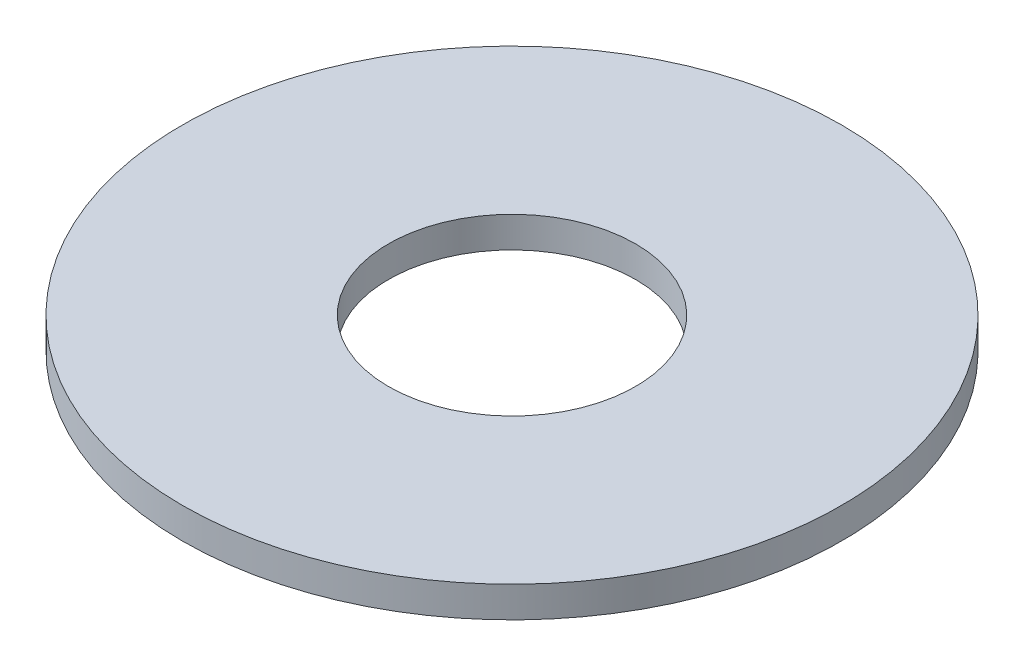
ISO-10303-21;
HEADER;
FILE_DESCRIPTION(('STEP AP214'),'2;1');
FILE_NAME('part.step','',(''),(''),'','','');
FILE_SCHEMA(('AUTOMOTIVE_DESIGN { 1 0 10303 214 1 1 1 1 }'));
ENDSEC;
DATA;
#1=APPLICATION_CONTEXT('core data for automotive mechanical design processes');
#2=APPLICATION_PROTOCOL_DEFINITION('international standard','automotive_design',2000,#1);
#3=PRODUCT_CONTEXT('',#1,'mechanical');
#4=PRODUCT('Part','Part','',(#3));
#5=PRODUCT_RELATED_PRODUCT_CATEGORY('part','',(#4));
#6=PRODUCT_DEFINITION_FORMATION('','',#4);
#7=PRODUCT_DEFINITION_CONTEXT('part definition',#1,'design');
#8=PRODUCT_DEFINITION('design','',#6,#7);
#9=PRODUCT_DEFINITION_SHAPE('','',#8);
#10=(LENGTH_UNIT() NAMED_UNIT(*) SI_UNIT(.MILLI.,.METRE.));
#11=(NAMED_UNIT(*) PLANE_ANGLE_UNIT() SI_UNIT($,.RADIAN.));
#12=(NAMED_UNIT(*) SI_UNIT($,.STERADIAN.) SOLID_ANGLE_UNIT());
#13=UNCERTAINTY_MEASURE_WITH_UNIT(LENGTH_MEASURE(1.E-05),#10,'distance_accuracy_value','');
#14=(GEOMETRIC_REPRESENTATION_CONTEXT(3) GLOBAL_UNCERTAINTY_ASSIGNED_CONTEXT((#13)) GLOBAL_UNIT_ASSIGNED_CONTEXT((#10,
#11,#12)) REPRESENTATION_CONTEXT('',''));
#15=CARTESIAN_POINT('',(0.,0.,0.));
#16=DIRECTION('',(0.,0.,1.));
#17=DIRECTION('',(1.,0.,0.));
#18=AXIS2_PLACEMENT_3D('',#15,#16,#17);
#19=CARTESIAN_POINT('',(0.,1.5,0.));
#20=DIRECTION('',(0.,1.,0.));
#21=DIRECTION('',(0.,0.,1.));
#22=AXIS2_PLACEMENT_3D('',#19,#20,#21);
#23=PLANE('',#22);
#24=CARTESIAN_POINT('',(0.,1.5,0.));
#25=DIRECTION('',(0.,1.,0.));
#26=DIRECTION('',(0.,0.,1.));
#27=AXIS2_PLACEMENT_3D('',#24,#25,#26);
#28=CIRCLE('',#27,16.);
#29=CARTESIAN_POINT('',(0.,1.5,16.));
#30=VERTEX_POINT('',#29);
#31=EDGE_CURVE('E10',#30,#30,#28,.T.);
#32=ORIENTED_EDGE('',*,*,#31,.T.);
#33=EDGE_LOOP('',(#32));
#34=FACE_BOUND('',#33,.T.);
#35=CARTESIAN_POINT('',(0.,1.5,0.));
#36=DIRECTION('',(0.,1.,0.));
#37=DIRECTION('',(0.,0.,1.));
#38=AXIS2_PLACEMENT_3D('',#35,#36,#37);
#39=CIRCLE('',#38,6.);
#40=CARTESIAN_POINT('',(0.,1.5,6.));
#41=VERTEX_POINT('',#40);
#42=EDGE_CURVE('E42',#41,#41,#39,.T.);
#43=ORIENTED_EDGE('',*,*,#42,.F.);
#44=EDGE_LOOP('',(#43));
#45=FACE_BOUND('',#44,.T.);
#46=ADVANCED_FACE('F31',(#34,#45),#23,.T.);
#47=CARTESIAN_POINT('',(0.,0.,0.));
#48=DIRECTION('',(0.,1.,0.));
#49=DIRECTION('',(0.,0.,1.));
#50=AXIS2_PLACEMENT_3D('',#47,#48,#49);
#51=PLANE('',#50);
#52=CARTESIAN_POINT('',(0.,0.,0.));
#53=DIRECTION('',(0.,1.,0.));
#54=DIRECTION('',(0.,0.,1.));
#55=AXIS2_PLACEMENT_3D('',#52,#53,#54);
#56=CIRCLE('',#55,16.);
#57=CARTESIAN_POINT('',(0.,0.,16.));
#58=VERTEX_POINT('',#57);
#59=EDGE_CURVE('E35',#58,#58,#56,.T.);
#60=ORIENTED_EDGE('',*,*,#59,.F.);
#61=EDGE_LOOP('',(#60));
#62=FACE_BOUND('',#61,.T.);
#63=CARTESIAN_POINT('',(0.,0.,0.));
#64=DIRECTION('',(0.,1.,0.));
#65=DIRECTION('',(0.,0.,1.));
#66=AXIS2_PLACEMENT_3D('',#63,#64,#65);
#67=CIRCLE('',#66,6.);
#68=CARTESIAN_POINT('',(0.,0.,6.));
#69=VERTEX_POINT('',#68);
#70=EDGE_CURVE('E44',#69,#69,#67,.T.);
#71=ORIENTED_EDGE('',*,*,#70,.T.);
#72=EDGE_LOOP('',(#71));
#73=FACE_BOUND('',#72,.T.);
#74=ADVANCED_FACE('F54',(#62,#73),#51,.F.);
#75=CARTESIAN_POINT('',(0.,1.5,0.));
#76=DIRECTION('',(0.,-1.,0.));
#77=DIRECTION('',(0.,0.,-1.));
#78=AXIS2_PLACEMENT_3D('',#75,#76,#77);
#79=CYLINDRICAL_SURFACE('',#78,16.);
#80=ORIENTED_EDGE('',*,*,#31,.F.);
#81=EDGE_LOOP('',(#80));
#82=FACE_BOUND('',#81,.T.);
#83=ORIENTED_EDGE('',*,*,#59,.T.);
#84=EDGE_LOOP('',(#83));
#85=FACE_BOUND('',#84,.T.);
#86=ADVANCED_FACE('F33',(#82,#85),#79,.T.);
#87=CARTESIAN_POINT('',(0.,1.5,0.));
#88=DIRECTION('',(0.,-1.,0.));
#89=DIRECTION('',(0.,0.,-1.));
#90=AXIS2_PLACEMENT_3D('',#87,#88,#89);
#91=CYLINDRICAL_SURFACE('',#90,6.);
#92=ORIENTED_EDGE('',*,*,#42,.T.);
#93=EDGE_LOOP('',(#92));
#94=FACE_BOUND('',#93,.T.);
#95=ORIENTED_EDGE('',*,*,#70,.F.);
#96=EDGE_LOOP('',(#95));
#97=FACE_BOUND('',#96,.T.);
#98=ADVANCED_FACE('F50',(#94,#97),#91,.F.);
#99=CLOSED_SHELL('',(#46,#74,#86,#98));
#100=MANIFOLD_SOLID_BREP('B2',#99);
#101=ADVANCED_BREP_SHAPE_REPRESENTATION('',(#18,#100),#14);
#102=SHAPE_DEFINITION_REPRESENTATION(#9,#101);
ENDSEC;
END-ISO-10303-21;
